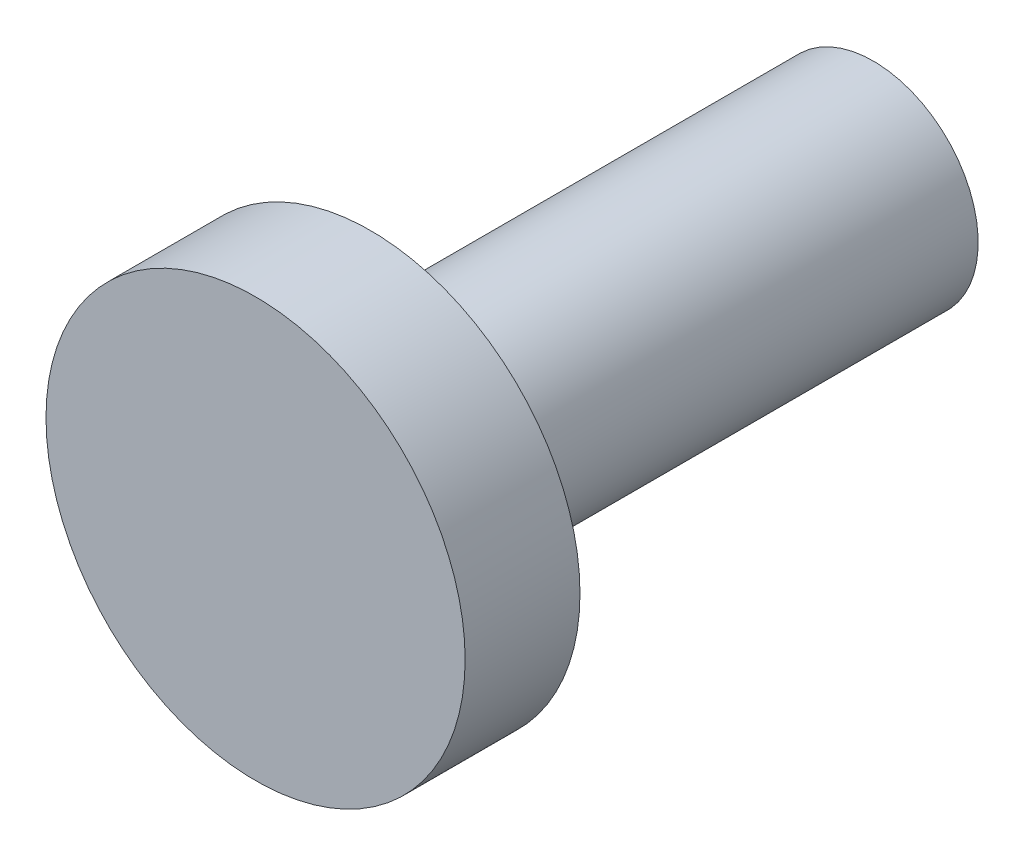
ISO-10303-21;
HEADER;
FILE_DESCRIPTION(('STEP AP214'),'2;1');
FILE_NAME('part.step','',(''),(''),'','','');
FILE_SCHEMA(('AUTOMOTIVE_DESIGN { 1 0 10303 214 1 1 1 1 }'));
ENDSEC;
DATA;
#1=APPLICATION_CONTEXT('core data for automotive mechanical design processes');
#2=APPLICATION_PROTOCOL_DEFINITION('international standard','automotive_design',2000,#1);
#3=PRODUCT_CONTEXT('',#1,'mechanical');
#4=PRODUCT('Part','Part','',(#3));
#5=PRODUCT_RELATED_PRODUCT_CATEGORY('part','',(#4));
#6=PRODUCT_DEFINITION_FORMATION('','',#4);
#7=PRODUCT_DEFINITION_CONTEXT('part definition',#1,'design');
#8=PRODUCT_DEFINITION('design','',#6,#7);
#9=PRODUCT_DEFINITION_SHAPE('','',#8);
#10=(LENGTH_UNIT() NAMED_UNIT(*) SI_UNIT(.MILLI.,.METRE.));
#11=(NAMED_UNIT(*) PLANE_ANGLE_UNIT() SI_UNIT($,.RADIAN.));
#12=(NAMED_UNIT(*) SI_UNIT($,.STERADIAN.) SOLID_ANGLE_UNIT());
#13=UNCERTAINTY_MEASURE_WITH_UNIT(LENGTH_MEASURE(1.E-05),#10,'distance_accuracy_value','');
#14=(GEOMETRIC_REPRESENTATION_CONTEXT(3) GLOBAL_UNCERTAINTY_ASSIGNED_CONTEXT((#13)) GLOBAL_UNIT_ASSIGNED_CONTEXT((#10,
#11,#12)) REPRESENTATION_CONTEXT('',''));
#15=CARTESIAN_POINT('',(0.,0.,0.));
#16=DIRECTION('',(0.,0.,1.));
#17=DIRECTION('',(1.,0.,0.));
#18=AXIS2_PLACEMENT_3D('',#15,#16,#17);
#19=CARTESIAN_POINT('',(0.,0.,1.37));
#20=DIRECTION('',(0.,0.,-1.));
#21=DIRECTION('',(-1.,0.,0.));
#22=AXIS2_PLACEMENT_3D('',#19,#20,#21);
#23=CYLINDRICAL_SURFACE('',#22,2.5);
#24=CARTESIAN_POINT('',(0.,0.,1.37));
#25=DIRECTION('',(0.,0.,1.));
#26=DIRECTION('',(1.,0.,0.));
#27=AXIS2_PLACEMENT_3D('',#24,#25,#26);
#28=CIRCLE('',#27,2.5);
#29=CARTESIAN_POINT('',(2.5,0.,1.37));
#30=VERTEX_POINT('',#29);
#31=EDGE_CURVE('E38',#30,#30,#28,.T.);
#32=ORIENTED_EDGE('',*,*,#31,.F.);
#33=EDGE_LOOP('',(#32));
#34=FACE_BOUND('',#33,.T.);
#35=CARTESIAN_POINT('',(0.,0.,0.));
#36=DIRECTION('',(0.,0.,1.));
#37=DIRECTION('',(1.,0.,0.));
#38=AXIS2_PLACEMENT_3D('',#35,#36,#37);
#39=CIRCLE('',#38,2.5);
#40=CARTESIAN_POINT('',(2.5,0.,0.));
#41=VERTEX_POINT('',#40);
#42=EDGE_CURVE('E34',#41,#41,#39,.T.);
#43=ORIENTED_EDGE('',*,*,#42,.T.);
#44=EDGE_LOOP('',(#43));
#45=FACE_BOUND('',#44,.T.);
#46=ADVANCED_FACE('F31',(#34,#45),#23,.T.);
#47=CARTESIAN_POINT('',(0.,0.,1.37));
#48=DIRECTION('',(0.,0.,1.));
#49=DIRECTION('',(1.,0.,0.));
#50=AXIS2_PLACEMENT_3D('',#47,#48,#49);
#51=PLANE('',#50);
#52=ORIENTED_EDGE('',*,*,#31,.T.);
#53=EDGE_LOOP('',(#52));
#54=FACE_BOUND('',#53,.T.);
#55=ADVANCED_FACE('F55',(#54),#51,.T.);
#56=CARTESIAN_POINT('',(0.,0.,0.));
#57=DIRECTION('',(0.,0.,1.));
#58=DIRECTION('',(1.,0.,0.));
#59=AXIS2_PLACEMENT_3D('',#56,#57,#58);
#60=PLANE('',#59);
#61=CARTESIAN_POINT('',(0.,0.,0.));
#62=DIRECTION('',(0.,0.,-1.));
#63=DIRECTION('',(-1.,0.,0.));
#64=AXIS2_PLACEMENT_3D('',#61,#62,#63);
#65=CIRCLE('',#64,1.25);
#66=CARTESIAN_POINT('',(-1.25,0.,0.));
#67=VERTEX_POINT('',#66);
#68=EDGE_CURVE('E10',#67,#67,#65,.T.);
#69=ORIENTED_EDGE('',*,*,#68,.F.);
#70=EDGE_LOOP('',(#69));
#71=FACE_BOUND('',#70,.T.);
#72=ORIENTED_EDGE('',*,*,#42,.F.);
#73=EDGE_LOOP('',(#72));
#74=FACE_BOUND('',#73,.T.);
#75=ADVANCED_FACE('F52',(#71,#74),#60,.F.);
#76=CARTESIAN_POINT('',(0.,0.,-6.));
#77=DIRECTION('',(0.,0.,1.));
#78=DIRECTION('',(1.,0.,0.));
#79=AXIS2_PLACEMENT_3D('',#76,#77,#78);
#80=CYLINDRICAL_SURFACE('',#79,1.25);
#81=CARTESIAN_POINT('',(0.,0.,-6.));
#82=DIRECTION('',(0.,0.,-1.));
#83=DIRECTION('',(-1.,0.,0.));
#84=AXIS2_PLACEMENT_3D('',#81,#82,#83);
#85=CIRCLE('',#84,1.25);
#86=CARTESIAN_POINT('',(-1.25,0.,-6.));
#87=VERTEX_POINT('',#86);
#88=EDGE_CURVE('E44',#87,#87,#85,.T.);
#89=ORIENTED_EDGE('',*,*,#88,.F.);
#90=EDGE_LOOP('',(#89));
#91=FACE_BOUND('',#90,.T.);
#92=ORIENTED_EDGE('',*,*,#68,.T.);
#93=EDGE_LOOP('',(#92));
#94=FACE_BOUND('',#93,.T.);
#95=ADVANCED_FACE('F54',(#91,#94),#80,.T.);
#96=CARTESIAN_POINT('',(0.,0.,-6.));
#97=DIRECTION('',(0.,0.,-1.));
#98=DIRECTION('',(-1.,0.,0.));
#99=AXIS2_PLACEMENT_3D('',#96,#97,#98);
#100=PLANE('',#99);
#101=ORIENTED_EDGE('',*,*,#88,.T.);
#102=EDGE_LOOP('',(#101));
#103=FACE_BOUND('',#102,.T.);
#104=ADVANCED_FACE('F61',(#103),#100,.T.);
#105=CLOSED_SHELL('',(#46,#55,#75,#95,#104));
#106=MANIFOLD_SOLID_BREP('B2',#105);
#107=ADVANCED_BREP_SHAPE_REPRESENTATION('',(#18,#106),#14);
#108=SHAPE_DEFINITION_REPRESENTATION(#9,#107);
ENDSEC;
END-ISO-10303-21;
